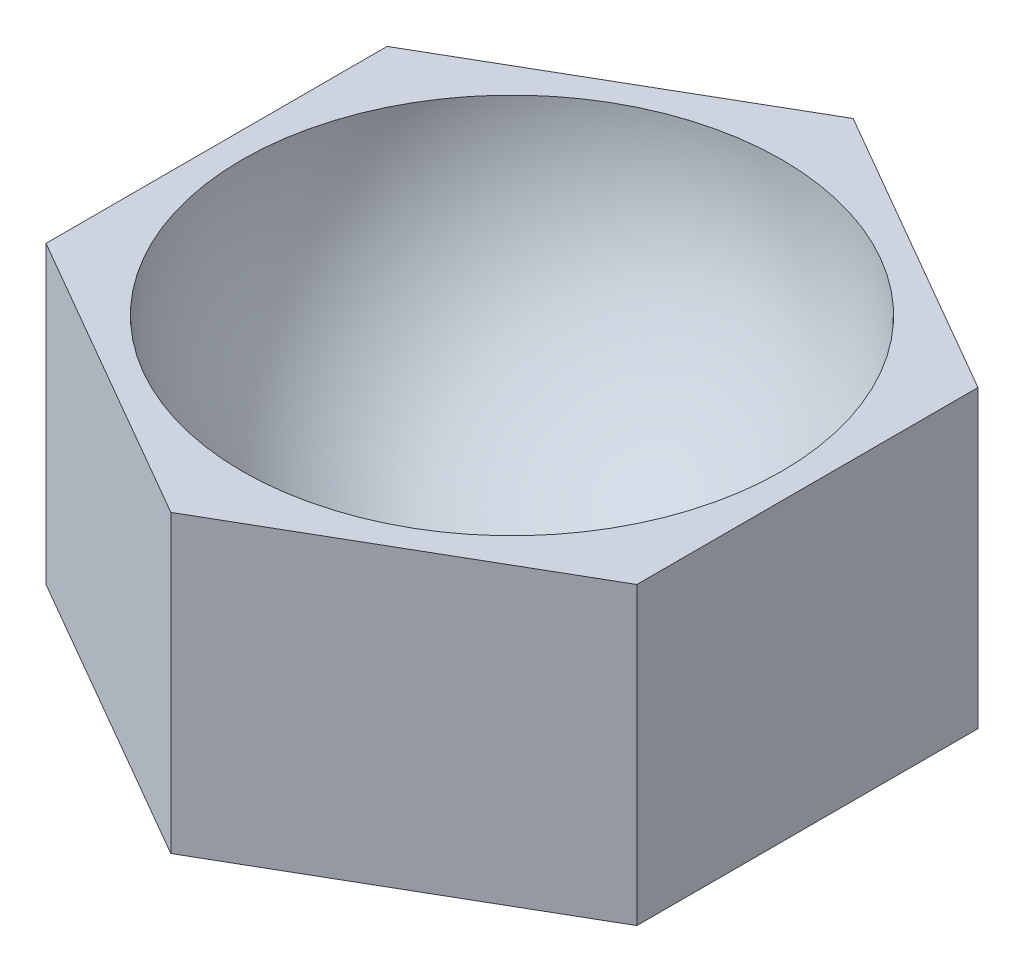
ISO-10303-21;
HEADER;
FILE_DESCRIPTION(('STEP AP214'),'2;1');
FILE_NAME('part.step','',(''),(''),'','','');
FILE_SCHEMA(('AUTOMOTIVE_DESIGN { 1 0 10303 214 1 1 1 1 }'));
ENDSEC;
DATA;
#1=APPLICATION_CONTEXT('core data for automotive mechanical design processes');
#2=APPLICATION_PROTOCOL_DEFINITION('international standard','automotive_design',2000,#1);
#3=PRODUCT_CONTEXT('',#1,'mechanical');
#4=PRODUCT('Part','Part','',(#3));
#5=PRODUCT_RELATED_PRODUCT_CATEGORY('part','',(#4));
#6=PRODUCT_DEFINITION_FORMATION('','',#4);
#7=PRODUCT_DEFINITION_CONTEXT('part definition',#1,'design');
#8=PRODUCT_DEFINITION('design','',#6,#7);
#9=PRODUCT_DEFINITION_SHAPE('','',#8);
#10=(LENGTH_UNIT() NAMED_UNIT(*) SI_UNIT(.MILLI.,.METRE.));
#11=(NAMED_UNIT(*) PLANE_ANGLE_UNIT() SI_UNIT($,.RADIAN.));
#12=(NAMED_UNIT(*) SI_UNIT($,.STERADIAN.) SOLID_ANGLE_UNIT());
#13=UNCERTAINTY_MEASURE_WITH_UNIT(LENGTH_MEASURE(1.E-05),#10,'distance_accuracy_value','');
#14=(GEOMETRIC_REPRESENTATION_CONTEXT(3) GLOBAL_UNCERTAINTY_ASSIGNED_CONTEXT((#13)) GLOBAL_UNIT_ASSIGNED_CONTEXT((#10,
#11,#12)) REPRESENTATION_CONTEXT('',''));
#15=CARTESIAN_POINT('',(0.,0.,0.));
#16=DIRECTION('',(0.,0.,1.));
#17=DIRECTION('',(1.,0.,0.));
#18=AXIS2_PLACEMENT_3D('',#15,#16,#17);
#19=CARTESIAN_POINT('',(0.,0.,0.));
#20=DIRECTION('',(0.,1.,0.));
#21=DIRECTION('',(-1.,0.,0.));
#22=AXIS2_PLACEMENT_3D('',#19,#20,#21);
#23=PLANE('',#22);
#24=DIRECTION('',(0.,0.,-1.));
#25=VECTOR('',#24,1.);
#26=CARTESIAN_POINT('',(50.8000000000001,-3.54734504026463E-13,29.3293936748329));
#27=LINE('',#26,#25);
#28=CARTESIAN_POINT('',(50.8000000000001,-3.54734504026463E-13,29.3293936748329));
#29=VERTEX_POINT('',#28);
#30=CARTESIAN_POINT('',(50.8,-3.54734504026462E-13,-29.3293936748331));
#31=VERTEX_POINT('',#30);
#32=EDGE_CURVE('E11',#29,#31,#27,.T.);
#33=ORIENTED_EDGE('',*,*,#32,.T.);
#34=DIRECTION('',(-0.866025403784439,0.,-0.499999999999999));
#35=VECTOR('',#34,1.);
#36=CARTESIAN_POINT('',(50.8,-3.54734504026462E-13,-29.3293936748331));
#37=LINE('',#36,#35);
#38=CARTESIAN_POINT('',(0.,0.,-58.658787349666));
#39=VERTEX_POINT('',#38);
#40=EDGE_CURVE('E44',#31,#39,#37,.T.);
#41=ORIENTED_EDGE('',*,*,#40,.T.);
#42=DIRECTION('',(-0.866025403784438,0.,0.500000000000002));
#43=VECTOR('',#42,1.);
#44=CARTESIAN_POINT('',(0.,0.,-58.658787349666));
#45=LINE('',#44,#43);
#46=CARTESIAN_POINT('',(-50.8000000000001,3.54734504026463E-13,-29.3293936748329));
#47=VERTEX_POINT('',#46);
#48=EDGE_CURVE('E99',#39,#47,#45,.T.);
#49=ORIENTED_EDGE('',*,*,#48,.T.);
#50=DIRECTION('',(0.,0.,1.));
#51=VECTOR('',#50,1.);
#52=CARTESIAN_POINT('',(-50.8000000000001,3.54734504026463E-13,-29.3293936748329));
#53=LINE('',#52,#51);
#54=CARTESIAN_POINT('',(-50.8,3.54734504026462E-13,29.3293936748331));
#55=VERTEX_POINT('',#54);
#56=EDGE_CURVE('E108',#47,#55,#53,.T.);
#57=ORIENTED_EDGE('',*,*,#56,.T.);
#58=DIRECTION('',(0.866025403784439,0.,0.499999999999999));
#59=VECTOR('',#58,1.);
#60=CARTESIAN_POINT('',(-50.8,3.54734504026462E-13,29.3293936748331));
#61=LINE('',#60,#59);
#62=CARTESIAN_POINT('',(0.,0.,58.658787349666));
#63=VERTEX_POINT('',#62);
#64=EDGE_CURVE('E113',#55,#63,#61,.T.);
#65=ORIENTED_EDGE('',*,*,#64,.T.);
#66=DIRECTION('',(0.866025403784438,0.,-0.500000000000001));
#67=VECTOR('',#66,1.);
#68=CARTESIAN_POINT('',(0.,0.,58.658787349666));
#69=LINE('',#68,#67);
#70=EDGE_CURVE('E128',#63,#29,#69,.T.);
#71=ORIENTED_EDGE('',*,*,#70,.T.);
#72=EDGE_LOOP('',(#33,#41,#49,#57,#65,#71));
#73=FACE_BOUND('',#72,.T.);
#74=CARTESIAN_POINT('',(0.,0.,0.));
#75=DIRECTION('',(0.,-1.,0.));
#76=DIRECTION('',(-1.,0.,0.));
#77=AXIS2_PLACEMENT_3D('',#74,#75,#76);
#78=CIRCLE('',#77,46.4);
#79=CARTESIAN_POINT('',(-46.4,3.24009468244643E-13,0.));
#80=VERTEX_POINT('',#79);
#81=EDGE_CURVE('E135',#80,#80,#78,.T.);
#82=ORIENTED_EDGE('',*,*,#81,.T.);
#83=EDGE_LOOP('',(#82));
#84=FACE_BOUND('',#83,.T.);
#85=ADVANCED_FACE('F35',(#73,#84),#23,.T.);
#86=CARTESIAN_POINT('',(50.7999999999997,-50.8000000000004,29.3293936748329));
#87=DIRECTION('',(1.,0.,0.));
#88=DIRECTION('',(0.,1.,0.));
#89=AXIS2_PLACEMENT_3D('',#86,#87,#88);
#90=PLANE('',#89);
#91=ORIENTED_EDGE('',*,*,#32,.F.);
#92=DIRECTION('',(0.,1.,0.));
#93=VECTOR('',#92,1.);
#94=CARTESIAN_POINT('',(50.7999999999997,-50.8000000000004,29.3293936748329));
#95=LINE('',#94,#93);
#96=CARTESIAN_POINT('',(50.7999999999997,-50.8000000000004,29.3293936748329));
#97=VERTEX_POINT('',#96);
#98=EDGE_CURVE('E88',#97,#29,#95,.T.);
#99=ORIENTED_EDGE('',*,*,#98,.F.);
#100=DIRECTION('',(0.,0.,-1.));
#101=VECTOR('',#100,1.);
#102=CARTESIAN_POINT('',(50.7999999999997,-50.8000000000004,29.3293936748329));
#103=LINE('',#102,#101);
#104=CARTESIAN_POINT('',(50.7999999999996,-50.8000000000004,-29.3293936748331));
#105=VERTEX_POINT('',#104);
#106=EDGE_CURVE('E38',#97,#105,#103,.T.);
#107=ORIENTED_EDGE('',*,*,#106,.T.);
#108=DIRECTION('',(0.,1.,0.));
#109=VECTOR('',#108,1.);
#110=CARTESIAN_POINT('',(50.7999999999996,-50.8000000000004,-29.3293936748331));
#111=LINE('',#110,#109);
#112=EDGE_CURVE('E53',#105,#31,#111,.T.);
#113=ORIENTED_EDGE('',*,*,#112,.T.);
#114=EDGE_LOOP('',(#91,#99,#107,#113));
#115=FACE_BOUND('',#114,.T.);
#116=ADVANCED_FACE('F154',(#115),#90,.T.);
#117=CARTESIAN_POINT('',(-2.71467777179576E-13,-50.8,58.658787349666));
#118=DIRECTION('',(0.500000000000001,0.,0.866025403784438));
#119=DIRECTION('',(0.866025403784438,0.,-0.500000000000001));
#120=AXIS2_PLACEMENT_3D('',#117,#118,#119);
#121=PLANE('',#120);
#122=ORIENTED_EDGE('',*,*,#70,.F.);
#123=DIRECTION('',(0.,1.,0.));
#124=VECTOR('',#123,1.);
#125=CARTESIAN_POINT('',(-2.71467777179576E-13,-50.8,58.658787349666));
#126=LINE('',#125,#124);
#127=CARTESIAN_POINT('',(-2.71467777179576E-13,-50.8,58.658787349666));
#128=VERTEX_POINT('',#127);
#129=EDGE_CURVE('E134',#128,#63,#126,.T.);
#130=ORIENTED_EDGE('',*,*,#129,.F.);
#131=DIRECTION('',(0.866025403784438,0.,-0.500000000000001));
#132=VECTOR('',#131,1.);
#133=CARTESIAN_POINT('',(-2.71467777179576E-13,-50.8,58.658787349666));
#134=LINE('',#133,#132);
#135=EDGE_CURVE('E120',#128,#97,#134,.T.);
#136=ORIENTED_EDGE('',*,*,#135,.T.);
#137=ORIENTED_EDGE('',*,*,#98,.T.);
#138=EDGE_LOOP('',(#122,#130,#136,#137));
#139=FACE_BOUND('',#138,.T.);
#140=ADVANCED_FACE('F158',(#139),#121,.T.);
#141=CARTESIAN_POINT('',(-50.8000000000003,-50.7999999999996,29.3293936748331));
#142=DIRECTION('',(-0.499999999999999,0.,0.866025403784439));
#143=DIRECTION('',(0.86602540378444,0.,0.499999999999999));
#144=AXIS2_PLACEMENT_3D('',#141,#142,#143);
#145=PLANE('',#144);
#146=ORIENTED_EDGE('',*,*,#64,.F.);
#147=DIRECTION('',(0.,1.,0.));
#148=VECTOR('',#147,1.);
#149=CARTESIAN_POINT('',(-50.8000000000003,-50.7999999999996,29.3293936748331));
#150=LINE('',#149,#148);
#151=CARTESIAN_POINT('',(-50.8000000000003,-50.7999999999996,29.3293936748331));
#152=VERTEX_POINT('',#151);
#153=EDGE_CURVE('E105',#152,#55,#150,.T.);
#154=ORIENTED_EDGE('',*,*,#153,.F.);
#155=DIRECTION('',(0.866025403784439,0.,0.499999999999999));
#156=VECTOR('',#155,1.);
#157=CARTESIAN_POINT('',(-50.8000000000003,-50.7999999999996,29.3293936748331));
#158=LINE('',#157,#156);
#159=EDGE_CURVE('E122',#152,#128,#158,.T.);
#160=ORIENTED_EDGE('',*,*,#159,.T.);
#161=ORIENTED_EDGE('',*,*,#129,.T.);
#162=EDGE_LOOP('',(#146,#154,#160,#161));
#163=FACE_BOUND('',#162,.T.);
#164=ADVANCED_FACE('F162',(#163),#145,.T.);
#165=CARTESIAN_POINT('',(-50.8000000000004,-50.7999999999996,-29.3293936748329));
#166=DIRECTION('',(-1.,0.,0.));
#167=DIRECTION('',(0.,-1.,0.));
#168=AXIS2_PLACEMENT_3D('',#165,#166,#167);
#169=PLANE('',#168);
#170=ORIENTED_EDGE('',*,*,#56,.F.);
#171=DIRECTION('',(0.,1.,0.));
#172=VECTOR('',#171,1.);
#173=CARTESIAN_POINT('',(-50.8000000000004,-50.7999999999996,-29.3293936748329));
#174=LINE('',#173,#172);
#175=CARTESIAN_POINT('',(-50.8000000000004,-50.7999999999996,-29.3293936748329));
#176=VERTEX_POINT('',#175);
#177=EDGE_CURVE('E95',#176,#47,#174,.T.);
#178=ORIENTED_EDGE('',*,*,#177,.F.);
#179=DIRECTION('',(0.,0.,1.));
#180=VECTOR('',#179,1.);
#181=CARTESIAN_POINT('',(-50.8000000000004,-50.7999999999996,-29.3293936748329));
#182=LINE('',#181,#180);
#183=EDGE_CURVE('E125',#176,#152,#182,.T.);
#184=ORIENTED_EDGE('',*,*,#183,.T.);
#185=ORIENTED_EDGE('',*,*,#153,.T.);
#186=EDGE_LOOP('',(#170,#178,#184,#185));
#187=FACE_BOUND('',#186,.T.);
#188=ADVANCED_FACE('F109',(#187),#169,.T.);
#189=CARTESIAN_POINT('',(-4.35399145659384E-13,-50.8,-58.658787349666));
#190=DIRECTION('',(-0.500000000000002,0.,-0.866025403784438));
#191=DIRECTION('',(-0.866025403784438,0.,0.500000000000002));
#192=AXIS2_PLACEMENT_3D('',#189,#190,#191);
#193=PLANE('',#192);
#194=ORIENTED_EDGE('',*,*,#48,.F.);
#195=DIRECTION('',(0.,1.,0.));
#196=VECTOR('',#195,1.);
#197=CARTESIAN_POINT('',(-4.35399145659384E-13,-50.8,-58.658787349666));
#198=LINE('',#197,#196);
#199=CARTESIAN_POINT('',(-4.35399145659384E-13,-50.8,-58.658787349666));
#200=VERTEX_POINT('',#199);
#201=EDGE_CURVE('E76',#200,#39,#198,.T.);
#202=ORIENTED_EDGE('',*,*,#201,.F.);
#203=DIRECTION('',(-0.866025403784438,0.,0.500000000000002));
#204=VECTOR('',#203,1.);
#205=CARTESIAN_POINT('',(-4.35399145659384E-13,-50.8,-58.658787349666));
#206=LINE('',#205,#204);
#207=EDGE_CURVE('E101',#200,#176,#206,.T.);
#208=ORIENTED_EDGE('',*,*,#207,.T.);
#209=ORIENTED_EDGE('',*,*,#177,.T.);
#210=EDGE_LOOP('',(#194,#202,#208,#209));
#211=FACE_BOUND('',#210,.T.);
#212=ADVANCED_FACE('F97',(#211),#193,.T.);
#213=CARTESIAN_POINT('',(50.7999999999996,-50.8000000000004,-29.3293936748331));
#214=DIRECTION('',(0.499999999999999,0.,-0.866025403784439));
#215=DIRECTION('',(-0.866025403784439,0.,-0.499999999999999));
#216=AXIS2_PLACEMENT_3D('',#213,#214,#215);
#217=PLANE('',#216);
#218=ORIENTED_EDGE('',*,*,#40,.F.);
#219=ORIENTED_EDGE('',*,*,#112,.F.);
#220=DIRECTION('',(-0.866025403784439,0.,-0.499999999999999));
#221=VECTOR('',#220,1.);
#222=CARTESIAN_POINT('',(50.7999999999996,-50.8000000000004,-29.3293936748331));
#223=LINE('',#222,#221);
#224=EDGE_CURVE('E127',#105,#200,#223,.T.);
#225=ORIENTED_EDGE('',*,*,#224,.T.);
#226=ORIENTED_EDGE('',*,*,#201,.T.);
#227=EDGE_LOOP('',(#218,#219,#225,#226));
#228=FACE_BOUND('',#227,.T.);
#229=ADVANCED_FACE('F150',(#228),#217,.T.);
#230=CARTESIAN_POINT('',(-3.54734504026462E-13,-50.8,0.));
#231=DIRECTION('',(0.,1.,0.));
#232=DIRECTION('',(-1.,0.,0.));
#233=AXIS2_PLACEMENT_3D('',#230,#231,#232);
#234=PLANE('',#233);
#235=ORIENTED_EDGE('',*,*,#106,.F.);
#236=ORIENTED_EDGE('',*,*,#135,.F.);
#237=ORIENTED_EDGE('',*,*,#159,.F.);
#238=ORIENTED_EDGE('',*,*,#183,.F.);
#239=ORIENTED_EDGE('',*,*,#207,.F.);
#240=ORIENTED_EDGE('',*,*,#224,.F.);
#241=EDGE_LOOP('',(#235,#236,#237,#238,#239,#240));
#242=FACE_BOUND('',#241,.T.);
#243=ADVANCED_FACE('F145',(#242),#234,.F.);
#244=CARTESIAN_POINT('',(0.,0.,0.));
#245=DIRECTION('',(0.,0.,1.));
#246=DIRECTION('',(1.,0.,0.));
#247=AXIS2_PLACEMENT_3D('',#244,#245,#246);
#248=SPHERICAL_SURFACE('',#247,46.4);
#249=CARTESIAN_POINT('',(0.,0.,0.));
#250=DIRECTION('',(0.,-1.,0.));
#251=DIRECTION('',(-1.,0.,0.));
#252=AXIS2_PLACEMENT_3D('',#249,#250,#251);
#253=SPHERICAL_SURFACE('',#252,46.4);
#254=ORIENTED_EDGE('',*,*,#81,.F.);
#255=EDGE_LOOP('',(#254));
#256=FACE_BOUND('',#255,.T.);
#257=ADVANCED_FACE('F143',(#256),#253,.F.);
#258=CLOSED_SHELL('',(#85,#116,#140,#164,#188,#212,#229,#243,#257));
#259=MANIFOLD_SOLID_BREP('B2',#258);
#260=ADVANCED_BREP_SHAPE_REPRESENTATION('',(#18,#259),#14);
#261=SHAPE_DEFINITION_REPRESENTATION(#9,#260);
ENDSEC;
END-ISO-10303-21;
